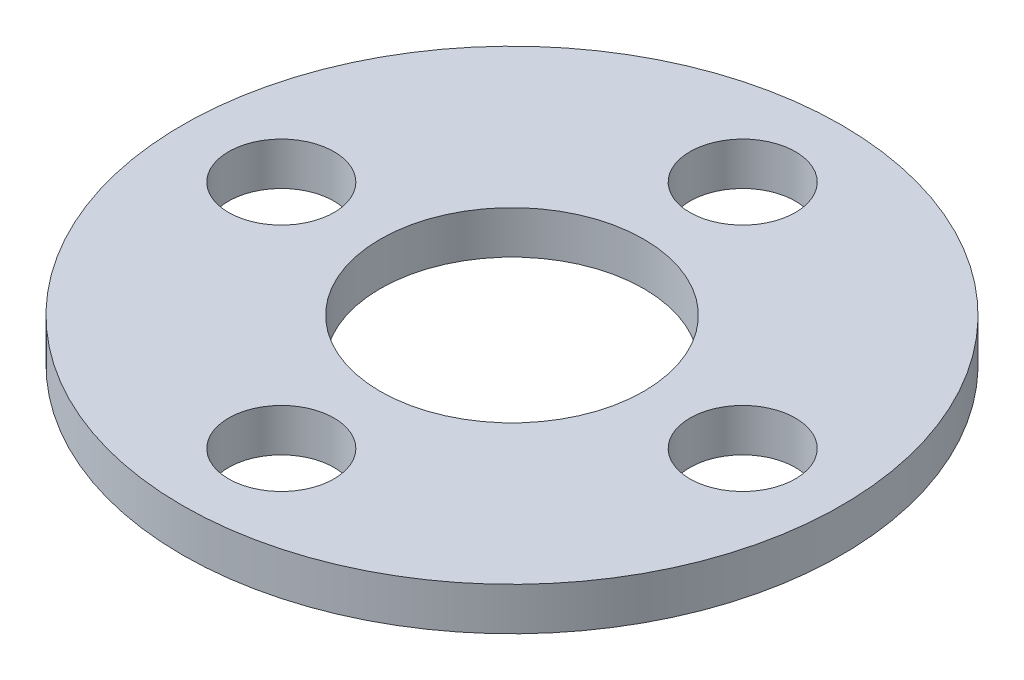
ISO-10303-21;
HEADER;
FILE_DESCRIPTION(('STEP AP214'),'2;1');
FILE_NAME('part.step','',(''),(''),'','','');
FILE_SCHEMA(('AUTOMOTIVE_DESIGN { 1 0 10303 214 1 1 1 1 }'));
ENDSEC;
DATA;
#1=APPLICATION_CONTEXT('core data for automotive mechanical design processes');
#2=APPLICATION_PROTOCOL_DEFINITION('international standard','automotive_design',2000,#1);
#3=PRODUCT_CONTEXT('',#1,'mechanical');
#4=PRODUCT('Part','Part','',(#3));
#5=PRODUCT_RELATED_PRODUCT_CATEGORY('part','',(#4));
#6=PRODUCT_DEFINITION_FORMATION('','',#4);
#7=PRODUCT_DEFINITION_CONTEXT('part definition',#1,'design');
#8=PRODUCT_DEFINITION('design','',#6,#7);
#9=PRODUCT_DEFINITION_SHAPE('','',#8);
#10=(LENGTH_UNIT() NAMED_UNIT(*) SI_UNIT(.MILLI.,.METRE.));
#11=(NAMED_UNIT(*) PLANE_ANGLE_UNIT() SI_UNIT($,.RADIAN.));
#12=(NAMED_UNIT(*) SI_UNIT($,.STERADIAN.) SOLID_ANGLE_UNIT());
#13=UNCERTAINTY_MEASURE_WITH_UNIT(LENGTH_MEASURE(1.E-05),#10,'distance_accuracy_value','');
#14=(GEOMETRIC_REPRESENTATION_CONTEXT(3) GLOBAL_UNCERTAINTY_ASSIGNED_CONTEXT((#13)) GLOBAL_UNIT_ASSIGNED_CONTEXT((#10,
#11,#12)) REPRESENTATION_CONTEXT('',''));
#15=CARTESIAN_POINT('',(0.,0.,0.));
#16=DIRECTION('',(0.,0.,1.));
#17=DIRECTION('',(1.,0.,0.));
#18=AXIS2_PLACEMENT_3D('',#15,#16,#17);
#19=CARTESIAN_POINT('',(0.,1.3,0.));
#20=DIRECTION('',(0.,1.,0.));
#21=DIRECTION('',(0.,0.,1.));
#22=AXIS2_PLACEMENT_3D('',#19,#20,#21);
#23=PLANE('',#22);
#24=CARTESIAN_POINT('',(7.,1.3,0.));
#25=DIRECTION('',(0.,1.,0.));
#26=DIRECTION('',(0.,0.,1.));
#27=AXIS2_PLACEMENT_3D('',#24,#25,#26);
#28=CIRCLE('',#27,1.6);
#29=CARTESIAN_POINT('',(7.,1.3,1.60000000000005));
#30=VERTEX_POINT('',#29);
#31=EDGE_CURVE('E81',#30,#30,#28,.T.);
#32=ORIENTED_EDGE('',*,*,#31,.F.);
#33=EDGE_LOOP('',(#32));
#34=FACE_BOUND('',#33,.T.);
#35=CARTESIAN_POINT('',(-7.,1.3,0.));
#36=DIRECTION('',(0.,1.,0.));
#37=DIRECTION('',(0.,0.,1.));
#38=AXIS2_PLACEMENT_3D('',#35,#36,#37);
#39=CIRCLE('',#38,1.6);
#40=CARTESIAN_POINT('',(-7.,1.3,1.6));
#41=VERTEX_POINT('',#40);
#42=EDGE_CURVE('E66',#41,#41,#39,.T.);
#43=ORIENTED_EDGE('',*,*,#42,.F.);
#44=EDGE_LOOP('',(#43));
#45=FACE_BOUND('',#44,.T.);
#46=CARTESIAN_POINT('',(0.,1.3,0.));
#47=DIRECTION('',(0.,1.,0.));
#48=DIRECTION('',(0.,0.,1.));
#49=AXIS2_PLACEMENT_3D('',#46,#47,#48);
#50=CIRCLE('',#49,10.);
#51=CARTESIAN_POINT('',(0.,1.3,10.));
#52=VERTEX_POINT('',#51);
#53=EDGE_CURVE('E10',#52,#52,#50,.T.);
#54=ORIENTED_EDGE('',*,*,#53,.T.);
#55=EDGE_LOOP('',(#54));
#56=FACE_BOUND('',#55,.T.);
#57=CARTESIAN_POINT('',(0.,1.3,0.));
#58=DIRECTION('',(0.,1.,0.));
#59=DIRECTION('',(0.,0.,1.));
#60=AXIS2_PLACEMENT_3D('',#57,#58,#59);
#61=CIRCLE('',#60,4.);
#62=CARTESIAN_POINT('',(0.,1.3,4.));
#63=VERTEX_POINT('',#62);
#64=EDGE_CURVE('E60',#63,#63,#61,.T.);
#65=ORIENTED_EDGE('',*,*,#64,.F.);
#66=EDGE_LOOP('',(#65));
#67=FACE_BOUND('',#66,.T.);
#68=CARTESIAN_POINT('',(0.,1.3,-7.));
#69=DIRECTION('',(0.,1.,0.));
#70=DIRECTION('',(0.,0.,1.));
#71=AXIS2_PLACEMENT_3D('',#68,#69,#70);
#72=CIRCLE('',#71,1.6);
#73=CARTESIAN_POINT('',(0.,1.3,-5.4));
#74=VERTEX_POINT('',#73);
#75=EDGE_CURVE('E73',#74,#74,#72,.T.);
#76=ORIENTED_EDGE('',*,*,#75,.F.);
#77=EDGE_LOOP('',(#76));
#78=FACE_BOUND('',#77,.T.);
#79=CARTESIAN_POINT('',(0.,1.3,7.));
#80=DIRECTION('',(0.,1.,0.));
#81=DIRECTION('',(0.,0.,1.));
#82=AXIS2_PLACEMENT_3D('',#79,#80,#81);
#83=CIRCLE('',#82,1.6);
#84=CARTESIAN_POINT('',(0.,1.3,8.6));
#85=VERTEX_POINT('',#84);
#86=EDGE_CURVE('E89',#85,#85,#83,.T.);
#87=ORIENTED_EDGE('',*,*,#86,.F.);
#88=EDGE_LOOP('',(#87));
#89=FACE_BOUND('',#88,.T.);
#90=ADVANCED_FACE('F45',(#34,#45,#56,#67,#78,#89),#23,.T.);
#91=CARTESIAN_POINT('',(0.,0.,0.));
#92=DIRECTION('',(0.,1.,0.));
#93=DIRECTION('',(0.,0.,1.));
#94=AXIS2_PLACEMENT_3D('',#91,#92,#93);
#95=PLANE('',#94);
#96=CARTESIAN_POINT('',(0.,0.,0.));
#97=DIRECTION('',(0.,1.,0.));
#98=DIRECTION('',(0.,0.,1.));
#99=AXIS2_PLACEMENT_3D('',#96,#97,#98);
#100=CIRCLE('',#99,10.);
#101=CARTESIAN_POINT('',(0.,0.,10.));
#102=VERTEX_POINT('',#101);
#103=EDGE_CURVE('E49',#102,#102,#100,.T.);
#104=ORIENTED_EDGE('',*,*,#103,.F.);
#105=EDGE_LOOP('',(#104));
#106=FACE_BOUND('',#105,.T.);
#107=CARTESIAN_POINT('',(0.,0.,0.));
#108=DIRECTION('',(0.,1.,0.));
#109=DIRECTION('',(0.,0.,1.));
#110=AXIS2_PLACEMENT_3D('',#107,#108,#109);
#111=CIRCLE('',#110,4.);
#112=CARTESIAN_POINT('',(0.,0.,4.));
#113=VERTEX_POINT('',#112);
#114=EDGE_CURVE('E62',#113,#113,#111,.T.);
#115=ORIENTED_EDGE('',*,*,#114,.T.);
#116=EDGE_LOOP('',(#115));
#117=FACE_BOUND('',#116,.T.);
#118=CARTESIAN_POINT('',(-7.,0.,0.));
#119=DIRECTION('',(0.,1.,0.));
#120=DIRECTION('',(0.,0.,1.));
#121=AXIS2_PLACEMENT_3D('',#118,#119,#120);
#122=CIRCLE('',#121,1.6);
#123=CARTESIAN_POINT('',(-7.,0.,1.6));
#124=VERTEX_POINT('',#123);
#125=EDGE_CURVE('E69',#124,#124,#122,.T.);
#126=ORIENTED_EDGE('',*,*,#125,.T.);
#127=EDGE_LOOP('',(#126));
#128=FACE_BOUND('',#127,.T.);
#129=CARTESIAN_POINT('',(0.,0.,-7.));
#130=DIRECTION('',(0.,1.,0.));
#131=DIRECTION('',(0.,0.,1.));
#132=AXIS2_PLACEMENT_3D('',#129,#130,#131);
#133=CIRCLE('',#132,1.6);
#134=CARTESIAN_POINT('',(0.,0.,-5.4));
#135=VERTEX_POINT('',#134);
#136=EDGE_CURVE('E77',#135,#135,#133,.T.);
#137=ORIENTED_EDGE('',*,*,#136,.T.);
#138=EDGE_LOOP('',(#137));
#139=FACE_BOUND('',#138,.T.);
#140=CARTESIAN_POINT('',(7.,0.,0.));
#141=DIRECTION('',(0.,1.,0.));
#142=DIRECTION('',(0.,0.,1.));
#143=AXIS2_PLACEMENT_3D('',#140,#141,#142);
#144=CIRCLE('',#143,1.6);
#145=CARTESIAN_POINT('',(7.,0.,1.60000000000005));
#146=VERTEX_POINT('',#145);
#147=EDGE_CURVE('E85',#146,#146,#144,.T.);
#148=ORIENTED_EDGE('',*,*,#147,.T.);
#149=EDGE_LOOP('',(#148));
#150=FACE_BOUND('',#149,.T.);
#151=CARTESIAN_POINT('',(0.,0.,7.));
#152=DIRECTION('',(0.,1.,0.));
#153=DIRECTION('',(0.,0.,1.));
#154=AXIS2_PLACEMENT_3D('',#151,#152,#153);
#155=CIRCLE('',#154,1.6);
#156=CARTESIAN_POINT('',(0.,0.,8.6));
#157=VERTEX_POINT('',#156);
#158=EDGE_CURVE('E93',#157,#157,#155,.T.);
#159=ORIENTED_EDGE('',*,*,#158,.T.);
#160=EDGE_LOOP('',(#159));
#161=FACE_BOUND('',#160,.T.);
#162=ADVANCED_FACE('F106',(#106,#117,#128,#139,#150,#161),#95,.F.);
#163=CARTESIAN_POINT('',(0.,1.3,0.));
#164=DIRECTION('',(0.,-1.,0.));
#165=DIRECTION('',(0.,0.,-1.));
#166=AXIS2_PLACEMENT_3D('',#163,#164,#165);
#167=CYLINDRICAL_SURFACE('',#166,10.);
#168=ORIENTED_EDGE('',*,*,#53,.F.);
#169=EDGE_LOOP('',(#168));
#170=FACE_BOUND('',#169,.T.);
#171=ORIENTED_EDGE('',*,*,#103,.T.);
#172=EDGE_LOOP('',(#171));
#173=FACE_BOUND('',#172,.T.);
#174=ADVANCED_FACE('F47',(#170,#173),#167,.T.);
#175=CARTESIAN_POINT('',(0.,1.3,0.));
#176=DIRECTION('',(0.,-1.,0.));
#177=DIRECTION('',(0.,0.,-1.));
#178=AXIS2_PLACEMENT_3D('',#175,#176,#177);
#179=CYLINDRICAL_SURFACE('',#178,4.);
#180=ORIENTED_EDGE('',*,*,#64,.T.);
#181=EDGE_LOOP('',(#180));
#182=FACE_BOUND('',#181,.T.);
#183=ORIENTED_EDGE('',*,*,#114,.F.);
#184=EDGE_LOOP('',(#183));
#185=FACE_BOUND('',#184,.T.);
#186=ADVANCED_FACE('F116',(#182,#185),#179,.F.);
#187=CARTESIAN_POINT('',(-7.,1.3,0.));
#188=DIRECTION('',(0.,-1.,0.));
#189=DIRECTION('',(0.,0.,-1.));
#190=AXIS2_PLACEMENT_3D('',#187,#188,#189);
#191=CYLINDRICAL_SURFACE('',#190,1.6);
#192=ORIENTED_EDGE('',*,*,#42,.T.);
#193=EDGE_LOOP('',(#192));
#194=FACE_BOUND('',#193,.T.);
#195=ORIENTED_EDGE('',*,*,#125,.F.);
#196=EDGE_LOOP('',(#195));
#197=FACE_BOUND('',#196,.T.);
#198=ADVANCED_FACE('F119',(#194,#197),#191,.F.);
#199=CARTESIAN_POINT('',(0.,1.3,-7.));
#200=DIRECTION('',(0.,-1.,0.));
#201=DIRECTION('',(0.,0.,-1.));
#202=AXIS2_PLACEMENT_3D('',#199,#200,#201);
#203=CYLINDRICAL_SURFACE('',#202,1.6);
#204=ORIENTED_EDGE('',*,*,#75,.T.);
#205=EDGE_LOOP('',(#204));
#206=FACE_BOUND('',#205,.T.);
#207=ORIENTED_EDGE('',*,*,#136,.F.);
#208=EDGE_LOOP('',(#207));
#209=FACE_BOUND('',#208,.T.);
#210=ADVANCED_FACE('F123',(#206,#209),#203,.F.);
#211=CARTESIAN_POINT('',(7.,1.3,0.));
#212=DIRECTION('',(0.,-1.,0.));
#213=DIRECTION('',(0.,0.,-1.));
#214=AXIS2_PLACEMENT_3D('',#211,#212,#213);
#215=CYLINDRICAL_SURFACE('',#214,1.6);
#216=ORIENTED_EDGE('',*,*,#31,.T.);
#217=EDGE_LOOP('',(#216));
#218=FACE_BOUND('',#217,.T.);
#219=ORIENTED_EDGE('',*,*,#147,.F.);
#220=EDGE_LOOP('',(#219));
#221=FACE_BOUND('',#220,.T.);
#222=ADVANCED_FACE('F127',(#218,#221),#215,.F.);
#223=CARTESIAN_POINT('',(0.,1.3,7.));
#224=DIRECTION('',(0.,-1.,0.));
#225=DIRECTION('',(0.,0.,-1.));
#226=AXIS2_PLACEMENT_3D('',#223,#224,#225);
#227=CYLINDRICAL_SURFACE('',#226,1.6);
#228=ORIENTED_EDGE('',*,*,#86,.T.);
#229=EDGE_LOOP('',(#228));
#230=FACE_BOUND('',#229,.T.);
#231=ORIENTED_EDGE('',*,*,#158,.F.);
#232=EDGE_LOOP('',(#231));
#233=FACE_BOUND('',#232,.T.);
#234=ADVANCED_FACE('F102',(#230,#233),#227,.F.);
#235=CLOSED_SHELL('',(#90,#162,#174,#186,#198,#210,#222,#234));
#236=MANIFOLD_SOLID_BREP('B2',#235);
#237=ADVANCED_BREP_SHAPE_REPRESENTATION('',(#18,#236),#14);
#238=SHAPE_DEFINITION_REPRESENTATION(#9,#237);
ENDSEC;
END-ISO-10303-21;
